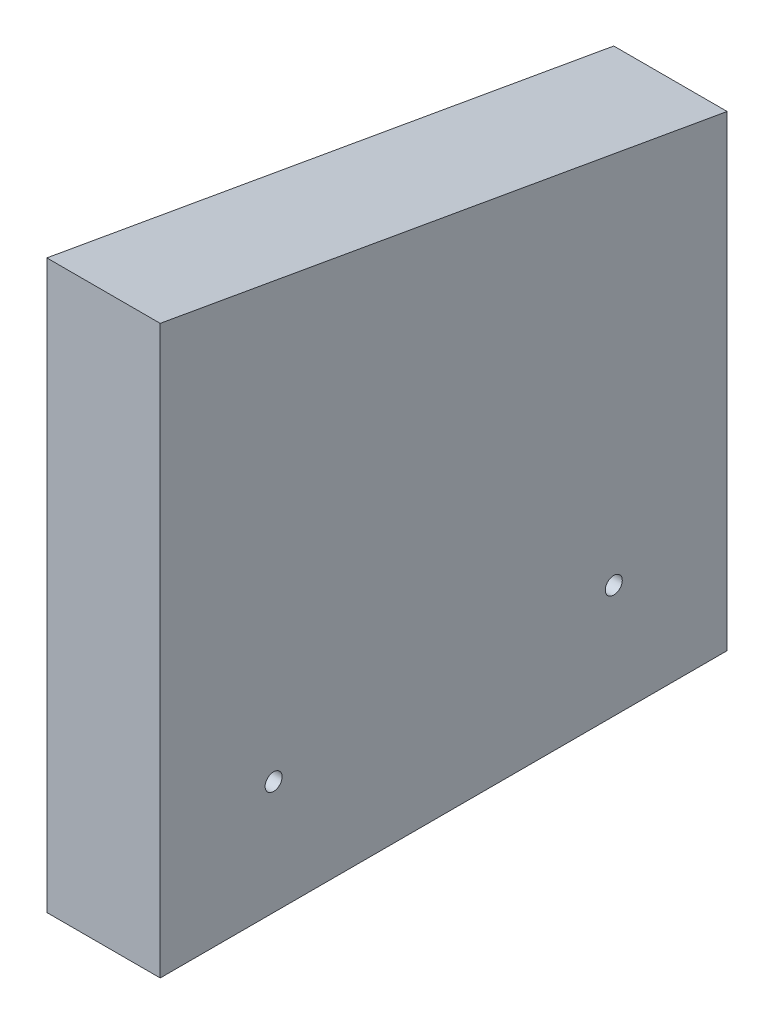
ISO-10303-21;
HEADER;
FILE_DESCRIPTION(('STEP AP214'),'2;1');
FILE_NAME('part.step','',(''),(''),'','','');
FILE_SCHEMA(('AUTOMOTIVE_DESIGN { 1 0 10303 214 1 1 1 1 }'));
ENDSEC;
DATA;
#1=APPLICATION_CONTEXT('core data for automotive mechanical design processes');
#2=APPLICATION_PROTOCOL_DEFINITION('international standard','automotive_design',2000,#1);
#3=PRODUCT_CONTEXT('',#1,'mechanical');
#4=PRODUCT('Part','Part','',(#3));
#5=PRODUCT_RELATED_PRODUCT_CATEGORY('part','',(#4));
#6=PRODUCT_DEFINITION_FORMATION('','',#4);
#7=PRODUCT_DEFINITION_CONTEXT('part definition',#1,'design');
#8=PRODUCT_DEFINITION('design','',#6,#7);
#9=PRODUCT_DEFINITION_SHAPE('','',#8);
#10=(LENGTH_UNIT() NAMED_UNIT(*) SI_UNIT(.MILLI.,.METRE.));
#11=(NAMED_UNIT(*) PLANE_ANGLE_UNIT() SI_UNIT($,.RADIAN.));
#12=(NAMED_UNIT(*) SI_UNIT($,.STERADIAN.) SOLID_ANGLE_UNIT());
#13=UNCERTAINTY_MEASURE_WITH_UNIT(LENGTH_MEASURE(1.E-05),#10,'distance_accuracy_value','');
#14=(GEOMETRIC_REPRESENTATION_CONTEXT(3) GLOBAL_UNCERTAINTY_ASSIGNED_CONTEXT((#13)) GLOBAL_UNIT_ASSIGNED_CONTEXT((#10,
#11,#12)) REPRESENTATION_CONTEXT('',''));
#15=CARTESIAN_POINT('',(0.,0.,0.));
#16=DIRECTION('',(0.,0.,1.));
#17=DIRECTION('',(1.,0.,0.));
#18=AXIS2_PLACEMENT_3D('',#15,#16,#17);
#19=CARTESIAN_POINT('',(5.,20.,-80.));
#20=DIRECTION('',(1.,0.,0.));
#21=DIRECTION('',(0.,0.,-1.));
#22=AXIS2_PLACEMENT_3D('',#19,#20,#21);
#23=PLANE('',#22);
#24=CARTESIAN_POINT('',(5.,20.,-80.));
#25=DIRECTION('',(1.,0.,0.));
#26=DIRECTION('',(0.,0.,-1.));
#27=AXIS2_PLACEMENT_3D('',#24,#25,#26);
#28=CIRCLE('',#27,1.5);
#29=CARTESIAN_POINT('',(5.,20.,-81.5));
#30=VERTEX_POINT('',#29);
#31=EDGE_CURVE('E20',#30,#30,#28,.T.);
#32=ORIENTED_EDGE('',*,*,#31,.T.);
#33=EDGE_LOOP('',(#32));
#34=FACE_BOUND('',#33,.T.);
#35=ADVANCED_FACE('F17',(#34),#23,.T.);
#36=CARTESIAN_POINT('',(5.,20.,-20.));
#37=DIRECTION('',(1.,0.,0.));
#38=DIRECTION('',(0.,0.,-1.));
#39=AXIS2_PLACEMENT_3D('',#36,#37,#38);
#40=PLANE('',#39);
#41=CARTESIAN_POINT('',(5.,20.,-20.));
#42=DIRECTION('',(1.,0.,0.));
#43=DIRECTION('',(0.,0.,-1.));
#44=AXIS2_PLACEMENT_3D('',#41,#42,#43);
#45=CIRCLE('',#44,1.5);
#46=CARTESIAN_POINT('',(5.,20.,-21.5));
#47=VERTEX_POINT('',#46);
#48=EDGE_CURVE('E89',#47,#47,#45,.T.);
#49=ORIENTED_EDGE('',*,*,#48,.T.);
#50=EDGE_LOOP('',(#49));
#51=FACE_BOUND('',#50,.T.);
#52=ADVANCED_FACE('F100',(#51),#40,.T.);
#53=CARTESIAN_POINT('',(5.,20.,-80.));
#54=DIRECTION('',(1.,0.,0.));
#55=DIRECTION('',(0.,0.,-1.));
#56=AXIS2_PLACEMENT_3D('',#53,#54,#55);
#57=CYLINDRICAL_SURFACE('',#56,1.5);
#58=CARTESIAN_POINT('',(20.,20.,-80.));
#59=DIRECTION('',(1.,0.,0.));
#60=DIRECTION('',(0.,0.,-1.));
#61=AXIS2_PLACEMENT_3D('',#58,#59,#60);
#62=CIRCLE('',#61,1.5);
#63=CARTESIAN_POINT('',(20.,20.,-81.5));
#64=VERTEX_POINT('',#63);
#65=EDGE_CURVE('E87',#64,#64,#62,.F.);
#66=ORIENTED_EDGE('',*,*,#65,.F.);
#67=EDGE_LOOP('',(#66));
#68=FACE_BOUND('',#67,.T.);
#69=ORIENTED_EDGE('',*,*,#31,.F.);
#70=EDGE_LOOP('',(#69));
#71=FACE_BOUND('',#70,.T.);
#72=ADVANCED_FACE('F97',(#68,#71),#57,.F.);
#73=CARTESIAN_POINT('',(5.,20.,-20.));
#74=DIRECTION('',(1.,0.,0.));
#75=DIRECTION('',(0.,0.,-1.));
#76=AXIS2_PLACEMENT_3D('',#73,#74,#75);
#77=CYLINDRICAL_SURFACE('',#76,1.5);
#78=CARTESIAN_POINT('',(20.,20.,-20.));
#79=DIRECTION('',(1.,0.,0.));
#80=DIRECTION('',(0.,0.,-1.));
#81=AXIS2_PLACEMENT_3D('',#78,#79,#80);
#82=CIRCLE('',#81,1.5);
#83=CARTESIAN_POINT('',(20.,20.,-21.5));
#84=VERTEX_POINT('',#83);
#85=EDGE_CURVE('E76',#84,#84,#82,.F.);
#86=ORIENTED_EDGE('',*,*,#85,.F.);
#87=EDGE_LOOP('',(#86));
#88=FACE_BOUND('',#87,.T.);
#89=ORIENTED_EDGE('',*,*,#48,.F.);
#90=EDGE_LOOP('',(#89));
#91=FACE_BOUND('',#90,.T.);
#92=ADVANCED_FACE('F99',(#88,#91),#77,.F.);
#93=CARTESIAN_POINT('',(20.,0.,0.));
#94=DIRECTION('',(1.,0.,0.));
#95=DIRECTION('',(0.,0.,-1.));
#96=AXIS2_PLACEMENT_3D('',#93,#94,#95);
#97=PLANE('',#96);
#98=DIRECTION('',(0.,0.173648177666931,0.984807753012208));
#99=VECTOR('',#98,1.);
#100=CARTESIAN_POINT('',(20.,96.9846310392954,-17.1010071662835));
#101=LINE('',#100,#99);
#102=CARTESIAN_POINT('',(20.,100.,0.));
#103=VERTEX_POINT('',#102);
#104=CARTESIAN_POINT('',(20.,82.3673019291535,-100.));
#105=VERTEX_POINT('',#104);
#106=EDGE_CURVE('E58',#103,#105,#101,.F.);
#107=ORIENTED_EDGE('',*,*,#106,.F.);
#108=DIRECTION('',(0.,1.,0.));
#109=VECTOR('',#108,1.);
#110=CARTESIAN_POINT('',(20.,0.,0.));
#111=LINE('',#110,#109);
#112=CARTESIAN_POINT('',(20.,0.,0.));
#113=VERTEX_POINT('',#112);
#114=EDGE_CURVE('E53',#113,#103,#111,.T.);
#115=ORIENTED_EDGE('',*,*,#114,.F.);
#116=DIRECTION('',(0.,0.,1.));
#117=VECTOR('',#116,1.);
#118=CARTESIAN_POINT('',(20.,0.,0.));
#119=LINE('',#118,#117);
#120=CARTESIAN_POINT('',(20.,0.,-100.));
#121=VERTEX_POINT('',#120);
#122=EDGE_CURVE('E72',#113,#121,#119,.F.);
#123=ORIENTED_EDGE('',*,*,#122,.T.);
#124=DIRECTION('',(0.,1.,0.));
#125=VECTOR('',#124,1.);
#126=CARTESIAN_POINT('',(20.,0.,-100.));
#127=LINE('',#126,#125);
#128=EDGE_CURVE('E67',#121,#105,#127,.T.);
#129=ORIENTED_EDGE('',*,*,#128,.T.);
#130=EDGE_LOOP('',(#107,#115,#123,#129));
#131=FACE_BOUND('',#130,.T.);
#132=ORIENTED_EDGE('',*,*,#85,.T.);
#133=EDGE_LOOP('',(#132));
#134=FACE_BOUND('',#133,.T.);
#135=ORIENTED_EDGE('',*,*,#65,.T.);
#136=EDGE_LOOP('',(#135));
#137=FACE_BOUND('',#136,.T.);
#138=ADVANCED_FACE('F70',(#131,#134,#137),#97,.T.);
#139=CARTESIAN_POINT('',(20.,0.,-100.));
#140=DIRECTION('',(0.,0.,1.));
#141=DIRECTION('',(1.,0.,0.));
#142=AXIS2_PLACEMENT_3D('',#139,#140,#141);
#143=PLANE('',#142);
#144=DIRECTION('',(1.,0.,0.));
#145=VECTOR('',#144,1.);
#146=CARTESIAN_POINT('',(20.,82.3673019291535,-100.));
#147=LINE('',#146,#145);
#148=CARTESIAN_POINT('',(0.,82.3673019291535,-100.));
#149=VERTEX_POINT('',#148);
#150=EDGE_CURVE('E63',#105,#149,#147,.F.);
#151=ORIENTED_EDGE('',*,*,#150,.F.);
#152=ORIENTED_EDGE('',*,*,#128,.F.);
#153=DIRECTION('',(1.,0.,0.));
#154=VECTOR('',#153,1.);
#155=CARTESIAN_POINT('',(20.,0.,-100.));
#156=LINE('',#155,#154);
#157=CARTESIAN_POINT('',(0.,0.,-100.));
#158=VERTEX_POINT('',#157);
#159=EDGE_CURVE('E198',#121,#158,#156,.F.);
#160=ORIENTED_EDGE('',*,*,#159,.T.);
#161=DIRECTION('',(0.,1.,0.));
#162=VECTOR('',#161,1.);
#163=CARTESIAN_POINT('',(0.,0.,-100.));
#164=LINE('',#163,#162);
#165=EDGE_CURVE('E80',#158,#149,#164,.T.);
#166=ORIENTED_EDGE('',*,*,#165,.T.);
#167=EDGE_LOOP('',(#151,#152,#160,#166));
#168=FACE_BOUND('',#167,.T.);
#169=ADVANCED_FACE('F79',(#168),#143,.F.);
#170=CARTESIAN_POINT('',(20.,96.9846310392954,-17.1010071662835));
#171=DIRECTION('',(0.,0.984807753012208,-0.173648177666931));
#172=DIRECTION('',(0.,0.173648177666931,0.984807753012208));
#173=AXIS2_PLACEMENT_3D('',#170,#171,#172);
#174=PLANE('',#173);
#175=ORIENTED_EDGE('',*,*,#106,.T.);
#176=ORIENTED_EDGE('',*,*,#150,.T.);
#177=DIRECTION('',(0.,0.173648177666931,0.984807753012208));
#178=VECTOR('',#177,1.);
#179=CARTESIAN_POINT('',(0.,82.3673019291535,-100.));
#180=LINE('',#179,#178);
#181=CARTESIAN_POINT('',(0.,100.,0.));
#182=VERTEX_POINT('',#181);
#183=EDGE_CURVE('E195',#149,#182,#180,.T.);
#184=ORIENTED_EDGE('',*,*,#183,.T.);
#185=DIRECTION('',(1.,0.,0.));
#186=VECTOR('',#185,1.);
#187=CARTESIAN_POINT('',(20.,100.,0.));
#188=LINE('',#187,#186);
#189=EDGE_CURVE('E65',#103,#182,#188,.F.);
#190=ORIENTED_EDGE('',*,*,#189,.F.);
#191=EDGE_LOOP('',(#175,#176,#184,#190));
#192=FACE_BOUND('',#191,.T.);
#193=ADVANCED_FACE('F60',(#192),#174,.T.);
#194=CARTESIAN_POINT('',(20.,0.,0.));
#195=DIRECTION('',(0.,0.,1.));
#196=DIRECTION('',(1.,0.,0.));
#197=AXIS2_PLACEMENT_3D('',#194,#195,#196);
#198=PLANE('',#197);
#199=ORIENTED_EDGE('',*,*,#114,.T.);
#200=ORIENTED_EDGE('',*,*,#189,.T.);
#201=DIRECTION('',(0.,1.,0.));
#202=VECTOR('',#201,1.);
#203=CARTESIAN_POINT('',(0.,0.,0.));
#204=LINE('',#203,#202);
#205=CARTESIAN_POINT('',(0.,0.,0.));
#206=VERTEX_POINT('',#205);
#207=EDGE_CURVE('E26',#182,#206,#204,.F.);
#208=ORIENTED_EDGE('',*,*,#207,.T.);
#209=DIRECTION('',(1.,0.,0.));
#210=VECTOR('',#209,1.);
#211=CARTESIAN_POINT('',(20.,0.,0.));
#212=LINE('',#211,#210);
#213=EDGE_CURVE('E34',#206,#113,#212,.T.);
#214=ORIENTED_EDGE('',*,*,#213,.T.);
#215=EDGE_LOOP('',(#199,#200,#208,#214));
#216=FACE_BOUND('',#215,.T.);
#217=ADVANCED_FACE('F119',(#216),#198,.T.);
#218=CARTESIAN_POINT('',(20.,0.,0.));
#219=DIRECTION('',(0.,1.,0.));
#220=DIRECTION('',(0.,0.,1.));
#221=AXIS2_PLACEMENT_3D('',#218,#219,#220);
#222=PLANE('',#221);
#223=ORIENTED_EDGE('',*,*,#159,.F.);
#224=ORIENTED_EDGE('',*,*,#122,.F.);
#225=ORIENTED_EDGE('',*,*,#213,.F.);
#226=DIRECTION('',(0.,0.,-1.));
#227=VECTOR('',#226,1.);
#228=CARTESIAN_POINT('',(0.,0.,0.));
#229=LINE('',#228,#227);
#230=EDGE_CURVE('E11',#206,#158,#229,.T.);
#231=ORIENTED_EDGE('',*,*,#230,.T.);
#232=EDGE_LOOP('',(#223,#224,#225,#231));
#233=FACE_BOUND('',#232,.T.);
#234=ADVANCED_FACE('F113',(#233),#222,.F.);
#235=CARTESIAN_POINT('',(0.,0.,0.));
#236=DIRECTION('',(1.,0.,0.));
#237=DIRECTION('',(0.,0.,-1.));
#238=AXIS2_PLACEMENT_3D('',#235,#236,#237);
#239=PLANE('',#238);
#240=ORIENTED_EDGE('',*,*,#207,.F.);
#241=ORIENTED_EDGE('',*,*,#183,.F.);
#242=ORIENTED_EDGE('',*,*,#165,.F.);
#243=ORIENTED_EDGE('',*,*,#230,.F.);
#244=EDGE_LOOP('',(#240,#241,#242,#243));
#245=FACE_BOUND('',#244,.T.);
#246=ADVANCED_FACE('F111',(#245),#239,.F.);
#247=CLOSED_SHELL('',(#35,#52,#72,#92,#138,#169,#193,#217,#234,#246));
#248=MANIFOLD_SOLID_BREP('B1',#247);
#249=ADVANCED_BREP_SHAPE_REPRESENTATION('',(#18,#248),#14);
#250=SHAPE_DEFINITION_REPRESENTATION(#9,#249);
ENDSEC;
END-ISO-10303-21;
